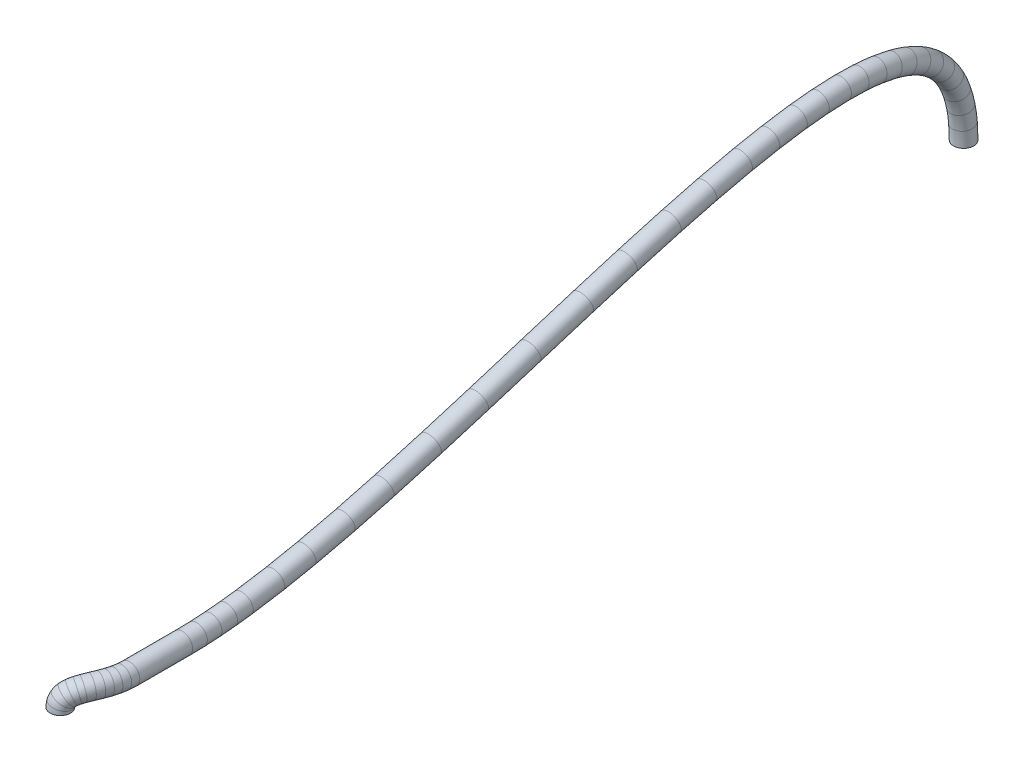
ISO-10303-21;
HEADER;
FILE_DESCRIPTION(('STEP AP214'),'2;1');
FILE_NAME('part.step','',(''),(''),'','','');
FILE_SCHEMA(('AUTOMOTIVE_DESIGN { 1 0 10303 214 1 1 1 1 }'));
ENDSEC;
DATA;
#1=APPLICATION_CONTEXT('core data for automotive mechanical design processes');
#2=APPLICATION_PROTOCOL_DEFINITION('international standard','automotive_design',2000,#1);
#3=PRODUCT_CONTEXT('',#1,'mechanical');
#4=PRODUCT('Part','Part','',(#3));
#5=PRODUCT_RELATED_PRODUCT_CATEGORY('part','',(#4));
#6=PRODUCT_DEFINITION_FORMATION('','',#4);
#7=PRODUCT_DEFINITION_CONTEXT('part definition',#1,'design');
#8=PRODUCT_DEFINITION('design','',#6,#7);
#9=PRODUCT_DEFINITION_SHAPE('','',#8);
#10=(LENGTH_UNIT() NAMED_UNIT(*) SI_UNIT(.MILLI.,.METRE.));
#11=(NAMED_UNIT(*) PLANE_ANGLE_UNIT() SI_UNIT($,.RADIAN.));
#12=(NAMED_UNIT(*) SI_UNIT($,.STERADIAN.) SOLID_ANGLE_UNIT());
#13=UNCERTAINTY_MEASURE_WITH_UNIT(LENGTH_MEASURE(1.E-05),#10,'distance_accuracy_value','');
#14=(GEOMETRIC_REPRESENTATION_CONTEXT(3) GLOBAL_UNCERTAINTY_ASSIGNED_CONTEXT((#13)) GLOBAL_UNIT_ASSIGNED_CONTEXT((#10,
#11,#12)) REPRESENTATION_CONTEXT('',''));
#15=CARTESIAN_POINT('',(0.,0.,0.));
#16=DIRECTION('',(0.,0.,1.));
#17=DIRECTION('',(1.,0.,0.));
#18=AXIS2_PLACEMENT_3D('',#15,#16,#17);
#19=CARTESIAN_POINT('',(-3.74968353162594,128.049999999714,243.374757540876));
#20=DIRECTION('',(0.,1.,0.));
#21=DIRECTION('',(0.,0.,-1.));
#22=AXIS2_PLACEMENT_3D('',#19,#20,#21);
#23=PLANE('',#22);
#24=CARTESIAN_POINT('',(-3.74968353162594,128.049999999714,243.374757540876));
#25=DIRECTION('',(0.,1.,0.));
#26=DIRECTION('',(0.,0.,1.));
#27=AXIS2_PLACEMENT_3D('',#24,#25,#26);
#28=CIRCLE('',#27,0.77);
#29=CARTESIAN_POINT('',(-3.74968353162594,128.049999999714,244.144757540876));
#30=VERTEX_POINT('',#29);
#31=EDGE_CURVE('E11',#30,#30,#28,.T.);
#32=ORIENTED_EDGE('',*,*,#31,.F.);
#33=EDGE_LOOP('',(#32));
#34=FACE_BOUND('',#33,.T.);
#35=ADVANCED_FACE('F42',(#34),#23,.F.);
#36=CARTESIAN_POINT('',(-3.57489488065331,128.049999999715,257.320595256948));
#37=DIRECTION('',(-0.999921466294672,0.,0.0125324077140817));
#38=DIRECTION('',(-0.0125324077140817,0.,-0.999921466294672));
#39=AXIS2_PLACEMENT_3D('',#36,#37,#38);
#40=TOROIDAL_SURFACE('',#39,13.9469330203994,0.77);
#41=ORIENTED_EDGE('',*,*,#31,.T.);
#42=EDGE_LOOP('',(#41));
#43=FACE_BOUND('',#42,.T.);
#44=CARTESIAN_POINT('',(-3.74904137688921,129.244421709112,243.42599305129));
#45=DIRECTION('',(0.00107328111656013,0.996326107369345,0.0856337307484272));
#46=DIRECTION('',(-4.60391044399756E-05,-0.0856337307484272,0.996326684395488));
#47=AXIS2_PLACEMENT_3D('',#44,#45,#46);
#48=CIRCLE('',#47,0.77);
#49=CARTESIAN_POINT('',(-3.74907682699963,129.178483736436,244.193164598274));
#50=VERTEX_POINT('',#49);
#51=EDGE_CURVE('E53',#50,#50,#48,.T.);
#52=ORIENTED_EDGE('',*,*,#51,.F.);
#53=EDGE_LOOP('',(#52));
#54=FACE_BOUND('',#53,.T.);
#55=ADVANCED_FACE('F363',(#43,#54),#40,.T.);
#56=CARTESIAN_POINT('',(-3.62396192345315,128.373826335564,253.5535753326));
#57=DIRECTION('',(0.999923726127993,-1.56135381442176E-05,-0.0123507765961814));
#58=DIRECTION('',(0.0123507765976869,0.,0.999923726249874));
#59=AXIS2_PLACEMENT_3D('',#56,#57,#58);
#60=TOROIDAL_SURFACE('',#59,10.1657023386898,0.77);
#61=CARTESIAN_POINT('',(-3.74689794232879,130.426519028251,243.598031978092));
#62=DIRECTION('',(0.0025092009655732,0.979401327154709,0.201907761807487));
#63=DIRECTION('',(-0.000256872652281758,-0.201907759491489,0.979404508195448));
#64=AXIS2_PLACEMENT_3D('',#61,#62,#63);
#65=CIRCLE('',#64,0.77);
#66=CARTESIAN_POINT('',(-3.74709573427105,130.271050053443,244.352173449402));
#67=VERTEX_POINT('',#66);
#68=EDGE_CURVE('E272',#67,#67,#65,.T.);
#69=ORIENTED_EDGE('',*,*,#68,.F.);
#70=EDGE_LOOP('',(#69));
#71=FACE_BOUND('',#70,.T.);
#72=ORIENTED_EDGE('',*,*,#51,.T.);
#73=EDGE_LOOP('',(#72));
#74=FACE_BOUND('',#73,.T.);
#75=ADVANCED_FACE('F369',(#71,#74),#60,.T.);
#76=CARTESIAN_POINT('',(-3.64297806845377,128.677711002938,252.079747241306));
#77=DIRECTION('',(0.999924861807434,-3.46504543539627E-05,-0.0122584476476254));
#78=DIRECTION('',(0.0122584476549845,0.,0.999924862407716));
#79=AXIS2_PLACEMENT_3D('',#76,#77,#78);
#80=TOROIDAL_SURFACE('',#79,8.66075185280262,0.77);
#81=CARTESIAN_POINT('',(-3.74293003548531,131.574581719271,243.91845002132));
#82=DIRECTION('',(0.00413288953237224,0.942401928786135,0.334457058296406));
#83=DIRECTION('',(-0.000714986324046932,-0.334457044428597,0.942410724804553));
#84=AXIS2_PLACEMENT_3D('',#81,#82,#83);
#85=CIRCLE('',#84,0.77);
#86=CARTESIAN_POINT('',(-3.74348057495483,131.317049795061,244.644106279419));
#87=VERTEX_POINT('',#86);
#88=EDGE_CURVE('E506',#87,#87,#85,.T.);
#89=ORIENTED_EDGE('',*,*,#88,.F.);
#90=EDGE_LOOP('',(#89));
#91=FACE_BOUND('',#90,.T.);
#92=ORIENTED_EDGE('',*,*,#68,.T.);
#93=EDGE_LOOP('',(#92));
#94=FACE_BOUND('',#93,.T.);
#95=ADVANCED_FACE('F515',(#91,#94),#80,.T.);
#96=CARTESIAN_POINT('',(-3.66728173386011,129.341525842741,250.2096119713));
#97=DIRECTION('',(0.999927259751701,-0.000104786281678555,-0.012060855081193));
#98=DIRECTION('',(0.012060855147408,0.,0.999927265241384));
#99=AXIS2_PLACEMENT_3D('',#96,#97,#98);
#100=TOROIDAL_SURFACE('',#99,6.67615008025848,0.77);
#101=CARTESIAN_POINT('',(-3.73682959366278,132.656122237585,244.414821748297));
#102=DIRECTION('',(0.00607896479311895,0.868046320935459,0.496445999981325));
#103=DIRECTION('',(-0.00162868645288827,-0.496445919935974,0.868066124186034));
#104=AXIS2_PLACEMENT_3D('',#101,#102,#103);
#105=CIRCLE('',#104,0.77);
#106=CARTESIAN_POINT('',(-3.7380836822315,132.273858879235,245.083232663921));
#107=VERTEX_POINT('',#106);
#108=EDGE_CURVE('E262',#107,#107,#105,.T.);
#109=ORIENTED_EDGE('',*,*,#108,.F.);
#110=EDGE_LOOP('',(#109));
#111=FACE_BOUND('',#110,.T.);
#112=ORIENTED_EDGE('',*,*,#88,.T.);
#113=EDGE_LOOP('',(#112));
#114=FACE_BOUND('',#113,.T.);
#115=ADVANCED_FACE('F527',(#111,#114),#100,.T.);
#116=CARTESIAN_POINT('',(-3.6737908037922,129.618432694617,249.725514193059));
#117=DIRECTION('',(0.999928443325836,-0.000161505477799532,-0.0119616948611179));
#118=DIRECTION('',(0.0119616950171224,0.,0.999928456366913));
#119=AXIS2_PLACEMENT_3D('',#116,#117,#118);
#120=TOROIDAL_SURFACE('',#119,6.1184136744201,0.77);
#121=CARTESIAN_POINT('',(-3.72911386483873,133.561643425338,245.04758576443));
#122=DIRECTION('',(0.00783258490682145,0.764619016978677,0.644434953651833));
#123=DIRECTION('',(-0.00288966355690719,-0.644434724493458,0.764653866603426));
#124=AXIS2_PLACEMENT_3D('',#121,#122,#123);
#125=CIRCLE('',#124,0.77);
#126=CARTESIAN_POINT('',(-3.73133890577755,133.065428687478,245.636369241715));
#127=VERTEX_POINT('',#126);
#128=EDGE_CURVE('E260',#127,#127,#125,.T.);
#129=ORIENTED_EDGE('',*,*,#128,.F.);
#130=EDGE_LOOP('',(#129));
#131=FACE_BOUND('',#130,.T.);
#132=ORIENTED_EDGE('',*,*,#108,.T.);
#133=EDGE_LOOP('',(#132));
#134=FACE_BOUND('',#133,.T.);
#135=ADVANCED_FACE('F615',(#131,#134),#120,.T.);
#136=CARTESIAN_POINT('',(-3.676303124242,129.698910660878,249.63005800289));
#137=DIRECTION('',(0.999930503616955,-0.000310253225086737,-0.011785231405404));
#138=DIRECTION('',(0.0117852319726099,0.,0.999930551742146));
#139=AXIS2_PLACEMENT_3D('',#136,#137,#138);
#140=TOROIDAL_SURFACE('',#139,5.99354195782575,0.77);
#141=CARTESIAN_POINT('',(-3.71960252022102,134.337006732867,245.834174022903));
#142=DIRECTION('',(0.00931648116066649,0.633370134036581,0.773792915765754));
#143=DIRECTION('',(-0.0044764870964178,-0.773792328230094,0.63342355011124));
#144=AXIS2_PLACEMENT_3D('',#141,#142,#143);
#145=CIRCLE('',#144,0.77);
#146=CARTESIAN_POINT('',(-3.72304941528527,133.74118664013,246.321910156489));
#147=VERTEX_POINT('',#146);
#148=EDGE_CURVE('E258',#147,#147,#145,.T.);
#149=ORIENTED_EDGE('',*,*,#148,.F.);
#150=EDGE_LOOP('',(#149));
#151=FACE_BOUND('',#150,.T.);
#152=ORIENTED_EDGE('',*,*,#128,.T.);
#153=EDGE_LOOP('',(#152));
#154=FACE_BOUND('',#153,.T.);
#155=ADVANCED_FACE('F410',(#151,#154),#140,.T.);
#156=CARTESIAN_POINT('',(-3.67427278205336,129.387492829691,249.88493735603));
#157=DIRECTION('',(0.999931484793308,-0.000416360646926431,-0.0116983914647522));
#158=DIRECTION('',(0.0116983924787466,0.,0.999931571465474));
#159=AXIS2_PLACEMENT_3D('',#156,#157,#158);
#160=TOROIDAL_SURFACE('',#159,6.39596953118865,0.77);
#161=CARTESIAN_POINT('',(-3.7084524315179,134.970619210377,246.764687716538));
#162=DIRECTION('',(0.0104148005759103,0.487875323146402,0.87285119063547));
#163=DIRECTION('',(-0.0062196697506987,-0.872850040660919,0.487948893047647));
#164=AXIS2_PLACEMENT_3D('',#161,#162,#163);
#165=CIRCLE('',#164,0.77);
#166=CARTESIAN_POINT('',(-3.71324157722594,134.298524679068,247.140408364185));
#167=VERTEX_POINT('',#166);
#168=EDGE_CURVE('E255',#167,#167,#165,.T.);
#169=ORIENTED_EDGE('',*,*,#168,.F.);
#170=EDGE_LOOP('',(#169));
#171=FACE_BOUND('',#170,.T.);
#172=ORIENTED_EDGE('',*,*,#148,.T.);
#173=EDGE_LOOP('',(#172));
#174=FACE_BOUND('',#173,.T.);
#175=ADVANCED_FACE('F406',(#171,#174),#160,.T.);
#176=CARTESIAN_POINT('',(-3.66806613831771,127.989365269457,250.666338930104));
#177=DIRECTION('',(0.999933013635121,-0.000673159565455074,-0.0115548733781388));
#178=DIRECTION('',(0.0115548759961493,0.,0.999933240191921));
#179=AXIS2_PLACEMENT_3D('',#176,#177,#178);
#180=TOROIDAL_SURFACE('',#179,7.99765089464495,0.77);
#181=CARTESIAN_POINT('',(-3.69633890299015,135.449911800551,247.785043051377));
#182=DIRECTION('',(0.011021391598779,0.360284488203109,0.932777367053602));
#183=DIRECTION('',(-0.00773420938151877,-0.932775406000503,0.360375115630698));
#184=AXIS2_PLACEMENT_3D('',#181,#182,#183);
#185=CIRCLE('',#184,0.77);
#186=CARTESIAN_POINT('',(-3.70229424421392,134.731674737931,248.062531890413));
#187=VERTEX_POINT('',#186);
#188=EDGE_CURVE('E259',#187,#187,#185,.T.);
#189=ORIENTED_EDGE('',*,*,#188,.F.);
#190=EDGE_LOOP('',(#189));
#191=FACE_BOUND('',#190,.T.);
#192=ORIENTED_EDGE('',*,*,#168,.T.);
#193=EDGE_LOOP('',(#192));
#194=FACE_BOUND('',#193,.T.);
#195=ADVANCED_FACE('F409',(#191,#194),#180,.T.);
#196=CARTESIAN_POINT('',(-3.66499366198673,126.759352754111,251.141393945651));
#197=DIRECTION('',(0.99993360202921,-0.000832261267531237,-0.0114934274292904));
#198=DIRECTION('',(0.0114934314098044,0.,0.999933948335803));
#199=AXIS2_PLACEMENT_3D('',#196,#197,#198);
#200=TOROIDAL_SURFACE('',#199,9.31621652760905,0.77);
#201=CARTESIAN_POINT('',(-3.68322899083849,135.801932792062,248.900121066387));
#202=DIRECTION('',(0.0113560651723383,0.240584108696933,0.970561861205304));
#203=DIRECTION('',(-0.00914133689401931,-0.970558910298777,0.240690335492395));
#204=AXIS2_PLACEMENT_3D('',#201,#202,#203);
#205=CIRCLE('',#204,0.77);
#206=CARTESIAN_POINT('',(-3.69026782024688,135.054602431132,249.085452624716));
#207=VERTEX_POINT('',#206);
#208=EDGE_CURVE('E280',#207,#207,#205,.T.);
#209=ORIENTED_EDGE('',*,*,#208,.F.);
#210=EDGE_LOOP('',(#209));
#211=FACE_BOUND('',#210,.T.);
#212=ORIENTED_EDGE('',*,*,#188,.T.);
#213=EDGE_LOOP('',(#212));
#214=FACE_BOUND('',#213,.T.);
#215=ADVANCED_FACE('F412',(#211,#214),#200,.T.);
#216=CARTESIAN_POINT('',(-3.66317642336996,123.386435817015,251.977455623718));
#217=DIRECTION('',(0.999934288916584,-0.00121053123396785,-0.0113996694257865));
#218=DIRECTION('',(0.0113996777782529,0.,0.999935021562177));
#219=AXIS2_PLACEMENT_3D('',#216,#217,#218);
#220=TOROIDAL_SURFACE('',#219,12.791206167543,0.77);
#221=CARTESIAN_POINT('',(-3.66986690857346,136.031256444592,250.047838626902));
#222=DIRECTION('',(0.0114518236066513,0.150851017771999,0.988490175051444));
#223=DIRECTION('',(-0.0101859073416779,-0.988486109490571,0.150968402772966));
#224=AXIS2_PLACEMENT_3D('',#221,#222,#223);
#225=CIRCLE('',#224,0.77);
#226=CARTESIAN_POINT('',(-3.67771005722656,135.270122140285,250.164084297038));
#227=VERTEX_POINT('',#226);
#228=EDGE_CURVE('E276',#227,#227,#225,.T.);
#229=ORIENTED_EDGE('',*,*,#228,.F.);
#230=EDGE_LOOP('',(#229));
#231=FACE_BOUND('',#230,.T.);
#232=ORIENTED_EDGE('',*,*,#208,.T.);
#233=EDGE_LOOP('',(#232));
#234=FACE_BOUND('',#233,.T.);
#235=ADVANCED_FACE('F415',(#231,#234),#220,.T.);
#236=CARTESIAN_POINT('',(-3.66548148912358,121.04671640111,252.334541067051));
#237=DIRECTION('',(0.99993438386414,-0.00144161136022933,-0.0113644059646101));
#238=DIRECTION('',(0.0113644177736289,0.,0.999935422919233));
#239=AXIS2_PLACEMENT_3D('',#236,#237,#238);
#240=TOROIDAL_SURFACE('',#239,15.1580166115629,0.77);
#241=CARTESIAN_POINT('',(-3.65422136859531,136.176266224485,251.406067616637));
#242=DIRECTION('',(0.0114313665546631,0.0612405030804673,0.998057575814714));
#243=DIRECTION('',(-0.0112180134444045,-0.998052125044579,0.0613686554224686));
#244=AXIS2_PLACEMENT_3D('',#241,#242,#243);
#245=CIRCLE('',#244,0.77);
#246=CARTESIAN_POINT('',(-3.6628592389475,135.4077660882,251.453321481312));
#247=VERTEX_POINT('',#246);
#248=EDGE_CURVE('E281',#247,#247,#245,.T.);
#249=ORIENTED_EDGE('',*,*,#248,.F.);
#250=EDGE_LOOP('',(#249));
#251=FACE_BOUND('',#250,.T.);
#252=ORIENTED_EDGE('',*,*,#228,.T.);
#253=EDGE_LOOP('',(#252));
#254=FACE_BOUND('',#253,.T.);
#255=ADVANCED_FACE('F549',(#251,#254),#240,.T.);
#256=CARTESIAN_POINT('',(-3.68281952873534,114.77656851712,252.719473978342));
#257=DIRECTION('',(0.999933770131024,-0.00203156120989126,-0.0113281997954771));
#258=DIRECTION('',(0.0113282231726545,0.,0.999935833621213));
#259=AXIS2_PLACEMENT_3D('',#256,#257,#258);
#260=TOROIDAL_SURFACE('',#259,21.4399840506549,0.77);
#261=CARTESIAN_POINT('',(-3.63866380234682,136.216442461495,252.772120093432));
#262=DIRECTION('',(0.0113231530981062,-0.0024786787673052,0.999932818921094));
#263=DIRECTION('',(-0.011943611286467,-0.999925926538434,-0.00234341325687878));
#264=AXIS2_PLACEMENT_3D('',#261,#262,#263);
#265=CIRCLE('',#264,0.77);
#266=CARTESIAN_POINT('',(-3.6478603830374,135.446499498061,252.770315665224));
#267=VERTEX_POINT('',#266);
#268=EDGE_CURVE('E282',#267,#267,#265,.T.);
#269=ORIENTED_EDGE('',*,*,#268,.F.);
#270=EDGE_LOOP('',(#269));
#271=FACE_BOUND('',#270,.T.);
#272=ORIENTED_EDGE('',*,*,#248,.T.);
#273=EDGE_LOOP('',(#272));
#274=FACE_BOUND('',#273,.T.);
#275=ADVANCED_FACE('F551',(#271,#274),#260,.T.);
#276=CARTESIAN_POINT('',(-3.70077807656531,110.657380501893,252.70946650955));
#277=DIRECTION('',(0.999932937891432,-0.00240229079995971,-0.0113291093525691));
#278=DIRECTION('',(0.0113291420428618,0.,0.999935823210956));
#279=AXIS2_PLACEMENT_3D('',#276,#277,#278);
#280=TOROIDAL_SURFACE('',#279,25.5592142271515,0.77);
#281=CARTESIAN_POINT('',(-3.61965239461575,136.156251354112,254.462873420404));
#282=DIRECTION('',(0.0111375608198057,-0.0686331117157715,0.997579796665508));
#283=DIRECTION('',(-0.0126873957821717,-0.997571066073339,-0.0684908615916703));
#284=AXIS2_PLACEMENT_3D('',#281,#282,#283);
#285=CIRCLE('',#284,0.77);
#286=CARTESIAN_POINT('',(-3.62942168936802,135.388121633235,254.410135456978));
#287=VERTEX_POINT('',#286);
#288=EDGE_CURVE('E286',#287,#287,#285,.T.);
#289=ORIENTED_EDGE('',*,*,#288,.F.);
#290=EDGE_LOOP('',(#289));
#291=FACE_BOUND('',#290,.T.);
#292=ORIENTED_EDGE('',*,*,#268,.T.);
#293=EDGE_LOOP('',(#292));
#294=FACE_BOUND('',#293,.T.);
#295=ADVANCED_FACE('F610',(#291,#294),#280,.T.);
#296=CARTESIAN_POINT('',(-3.77324801372848,99.4965880502139,251.942417317701));
#297=DIRECTION('',(0.999929239218928,-0.00340582268664042,-0.0113981106716906));
#298=DIRECTION('',(0.0113981767791885,0.,0.999935038673068));
#299=AXIS2_PLACEMENT_3D('',#296,#297,#298);
#300=TOROIDAL_SURFACE('',#299,36.7465264227112,0.77);
#301=CARTESIAN_POINT('',(-3.60097097834687,136.001245847421,256.148066359987));
#302=DIRECTION('',(0.0109332901309618,-0.114495586102539,0.993363591002785));
#303=DIRECTION('',(-0.0131957632904346,-0.993352983136303,-0.1143491264741));
#304=AXIS2_PLACEMENT_3D('',#301,#302,#303);
#305=CIRCLE('',#304,0.77);
#306=CARTESIAN_POINT('',(-3.61113171608051,135.236364050406,256.060017532601));
#307=VERTEX_POINT('',#306);
#308=EDGE_CURVE('E313',#307,#307,#305,.T.);
#309=ORIENTED_EDGE('',*,*,#308,.F.);
#310=EDGE_LOOP('',(#309));
#311=FACE_BOUND('',#310,.T.);
#312=ORIENTED_EDGE('',*,*,#288,.T.);
#313=EDGE_LOOP('',(#312));
#314=FACE_BOUND('',#313,.T.);
#315=ADVANCED_FACE('F372',(#311,#314),#300,.T.);
#316=CARTESIAN_POINT('',(-3.83695933223886,92.2051185638422,251.102700112807));
#317=DIRECTION('',(0.999925902291017,-0.00406610011188762,-0.0114741778518016));
#318=DIRECTION('',(0.011474272705245,0.,0.999934168366041));
#319=AXIS2_PLACEMENT_3D('',#316,#317,#318);
#320=TOROIDAL_SURFACE('',#319,44.0864171385112,0.77);
#321=CARTESIAN_POINT('',(-3.5779174970338,135.705597552396,258.261848190952));
#322=DIRECTION('',(0.0106613884787951,-0.162444361746452,0.986660105675958));
#323=DIRECTION('',(-0.0137186629416297,-0.986647080967109,-0.162293979882735));
#324=AXIS2_PLACEMENT_3D('',#321,#322,#323);
#325=CIRCLE('',#324,0.77);
#326=CARTESIAN_POINT('',(-3.58848086749885,134.945879300052,258.136881826443));
#327=VERTEX_POINT('',#326);
#328=EDGE_CURVE('E305',#327,#327,#325,.T.);
#329=ORIENTED_EDGE('',*,*,#328,.F.);
#330=EDGE_LOOP('',(#329));
#331=FACE_BOUND('',#330,.T.);
#332=ORIENTED_EDGE('',*,*,#308,.T.);
#333=EDGE_LOOP('',(#332));
#334=FACE_BOUND('',#333,.T.);
#335=ADVANCED_FACE('F417',(#331,#334),#320,.T.);
#336=CARTESIAN_POINT('',(-4.08426599900101,71.8011531395204,247.746050250386));
#337=DIRECTION('',(0.999912601927666,-0.00598279508960853,-0.0117896000424699));
#338=DIRECTION('',(0.011789811045646,0.,0.999930497762474));
#339=AXIS2_PLACEMENT_3D('',#336,#337,#338);
#340=TOROIDAL_SURFACE('',#339,64.7658583734563,0.77);
#341=CARTESIAN_POINT('',(-3.55543554196876,135.324139513465,260.362188777444));
#342=DIRECTION('',(0.0103979295285411,-0.194875369792719,0.980772895888579));
#343=DIRECTION('',(-0.0140657835414622,-0.980757382188605,-0.194723165072674));
#344=AXIS2_PLACEMENT_3D('',#341,#342,#343);
#345=CIRCLE('',#344,0.77);
#346=CARTESIAN_POINT('',(-3.56626619529569,134.56895632918,260.212251940339));
#347=VERTEX_POINT('',#346);
#348=EDGE_CURVE('E253',#347,#347,#345,.T.);
#349=ORIENTED_EDGE('',*,*,#348,.F.);
#350=EDGE_LOOP('',(#349));
#351=FACE_BOUND('',#350,.T.);
#352=ORIENTED_EDGE('',*,*,#328,.T.);
#353=EDGE_LOOP('',(#352));
#354=FACE_BOUND('',#353,.T.);
#355=ADVANCED_FACE('F404',(#351,#354),#340,.T.);
#356=CARTESIAN_POINT('',(-4.31591775887795,57.5750148695578,244.921833483145));
#357=DIRECTION('',(0.999899919531076,-0.00738368115377129,-0.0120678156418905));
#358=DIRECTION('',(0.0120681446164382,0.,0.999927177291185));
#359=AXIS2_PLACEMENT_3D('',#356,#357,#358);
#360=TOROIDAL_SURFACE('',#359,79.2711125676326,0.77);
#361=CARTESIAN_POINT('',(-3.52680457670898,134.730170501625,263.097876712832));
#362=DIRECTION('',(0.0100526920883623,-0.229386802407344,0.973283431618514));
#363=DIRECTION('',(-0.0144269577185918,-0.973264576160402,-0.229233347666301));
#364=AXIS2_PLACEMENT_3D('',#361,#362,#363);
#365=CIRCLE('',#364,0.77);
#366=CARTESIAN_POINT('',(-3.5379133341523,133.980756777982,262.921367035129));
#367=VERTEX_POINT('',#366);
#368=EDGE_CURVE('E249',#367,#367,#365,.T.);
#369=ORIENTED_EDGE('',*,*,#368,.F.);
#370=EDGE_LOOP('',(#369));
#371=FACE_BOUND('',#370,.T.);
#372=ORIENTED_EDGE('',*,*,#348,.T.);
#373=EDGE_LOOP('',(#372));
#374=FACE_BOUND('',#373,.T.);
#375=ADVANCED_FACE('F401',(#371,#374),#360,.T.);
#376=CARTESIAN_POINT('',(-5.3916457097763,12.5276460749525,234.316024745884));
#377=DIRECTION('',(0.999839165076537,-0.0121510282503366,-0.0131907729687246));
#378=DIRECTION('',(0.0131917468688151,0.,0.99991298512148));
#379=AXIS2_PLACEMENT_3D('',#376,#377,#378);
#380=TOROIDAL_SURFACE('',#379,125.560063759742,0.77);
#381=CARTESIAN_POINT('',(-3.499124076831,134.057583464795,265.815584921231));
#382=DIRECTION('',(0.00971902793698738,-0.251030915605625,0.967930276366104));
#383=DIRECTION('',(-0.0146474139412622,-0.967907881078682,-0.250878032140339));
#384=AXIS2_PLACEMENT_3D('',#381,#382,#383);
#385=CIRCLE('',#384,0.77);
#386=CARTESIAN_POINT('',(-3.51040258556577,133.312294396364,265.622408836483));
#387=VERTEX_POINT('',#386);
#388=EDGE_CURVE('E254',#387,#387,#385,.T.);
#389=ORIENTED_EDGE('',*,*,#388,.F.);
#390=EDGE_LOOP('',(#389));
#391=FACE_BOUND('',#390,.T.);
#392=ORIENTED_EDGE('',*,*,#368,.T.);
#393=EDGE_LOOP('',(#392));
#394=FACE_BOUND('',#393,.T.);
#395=ADVANCED_FACE('F376',(#391,#394),#380,.T.);
#396=CARTESIAN_POINT('',(-6.63767229498544,-23.3288101017454,225.029230979255));
#397=DIRECTION('',(0.999766490161775,-0.0162437742654542,-0.0142514892982556));
#398=DIRECTION('',(-0.0162454241122349,-0.999868034390246,0.));
#399=AXIS2_PLACEMENT_3D('',#396,#397,#398);
#400=TOROIDAL_SURFACE('',#399,162.615663552684,0.77);
#401=CARTESIAN_POINT('',(-3.46593820794016,133.145546053802,269.183166265566));
#402=DIRECTION('',(0.00930270812436092,-0.271737825723965,0.962326355085615));
#403=DIRECTION('',(-0.0148514872069348,-0.962299395928259,-0.271586645334139));
#404=AXIS2_PLACEMENT_3D('',#401,#402,#403);
#405=CIRCLE('',#404,0.77);
#406=CARTESIAN_POINT('',(-3.4773738530895,132.404575518937,268.974044548659));
#407=VERTEX_POINT('',#406);
#408=EDGE_CURVE('E219',#407,#407,#405,.T.);
#409=ORIENTED_EDGE('',*,*,#408,.F.);
#410=EDGE_LOOP('',(#409));
#411=FACE_BOUND('',#410,.T.);
#412=ORIENTED_EDGE('',*,*,#388,.T.);
#413=EDGE_LOOP('',(#412));
#414=FACE_BOUND('',#413,.T.);
#415=ADVANCED_FACE('F373',(#411,#414),#400,.T.);
#416=CARTESIAN_POINT('',(-16.9990722425859,-186.818386888551,178.963867798838));
#417=DIRECTION('',(0.999129131083776,-0.0366199012053915,-0.0199990563649066));
#418=DIRECTION('',(-0.0366272266920443,-0.99932899801059,0.));
#419=AXIS2_PLACEMENT_3D('',#416,#417,#418);
#420=TOROIDAL_SURFACE('',#419,332.71547291427,0.77);
#421=CARTESIAN_POINT('',(-3.43422373253834,132.179814249409,272.535917430186));
#422=DIRECTION('',(0.00887564310102645,-0.281807888255375,0.959429797888616));
#423=DIRECTION('',(-0.0149467755076472,-0.959397788967474,-0.281660214489455));
#424=AXIS2_PLACEMENT_3D('',#421,#422,#423);
#425=CIRCLE('',#424,0.77);
#426=CARTESIAN_POINT('',(-3.44573274967923,131.441077951904,272.31903906503));
#427=VERTEX_POINT('',#426);
#428=EDGE_CURVE('E213',#427,#427,#425,.T.);
#429=ORIENTED_EDGE('',*,*,#428,.F.);
#430=EDGE_LOOP('',(#429));
#431=FACE_BOUND('',#430,.T.);
#432=ORIENTED_EDGE('',*,*,#408,.T.);
#433=EDGE_LOOP('',(#432));
#434=FACE_BOUND('',#433,.T.);
#435=ADVANCED_FACE('F375',(#431,#434),#420,.T.);
#436=CARTESIAN_POINT('',(-49.3662060078035,-443.679255745309,103.817004464301));
#437=DIRECTION('',(0.997043751117183,-0.0707369243477478,-0.0300007648568781));
#438=DIRECTION('',(-0.0707687790914956,-0.997492746793629,0.));
#439=AXIS2_PLACEMENT_3D('',#436,#437,#438);
#440=TOROIDAL_SURFACE('',#439,601.821806752885,0.77);
#441=CARTESIAN_POINT('',(-3.39817440198848,130.985994759763,276.548811076564));
#442=DIRECTION('',(0.00834446385746464,-0.288457883314737,0.957456223268987));
#443=DIRECTION('',(-0.0150065627843381,-0.957417857161314,-0.288315538710694));
#444=AXIS2_PLACEMENT_3D('',#441,#442,#443);
#445=CIRCLE('',#444,0.77);
#446=CARTESIAN_POINT('',(-3.40972945533242,130.248783009749,276.326808111757));
#447=VERTEX_POINT('',#446);
#448=EDGE_CURVE('E209',#447,#447,#445,.T.);
#449=ORIENTED_EDGE('',*,*,#448,.F.);
#450=EDGE_LOOP('',(#449));
#451=FACE_BOUND('',#450,.T.);
#452=ORIENTED_EDGE('',*,*,#428,.T.);
#453=EDGE_LOOP('',(#452));
#454=FACE_BOUND('',#453,.T.);
#455=ADVANCED_FACE('F389',(#451,#454),#440,.T.);
#456=CARTESIAN_POINT('',(-126.82287610893,1006.20272826002,541.305646105521));
#457=DIRECTION('',(-0.990977551170584,-0.130471344857354,-0.0306711794208363));
#458=DIRECTION('',(-0.130532756772493,0.991443997111977,0.));
#459=AXIS2_PLACEMENT_3D('',#456,#457,#458);
#460=TOROIDAL_SURFACE('',#459,922.67771691141,0.77);
#461=CARTESIAN_POINT('',(-3.36450797302752,129.787270950207,280.560278341283));
#462=DIRECTION('',(0.00773737452209681,-0.28415059232391,0.95874844141593));
#463=DIRECTION('',(-0.014970480312079,-0.958702606388962,-0.284016191831094));
#464=AXIS2_PLACEMENT_3D('',#461,#462,#463);
#465=CIRCLE('',#464,0.77);
#466=CARTESIAN_POINT('',(-3.37603524286782,129.049069943287,280.341585873573));
#467=VERTEX_POINT('',#466);
#468=EDGE_CURVE('E46',#467,#467,#465,.T.);
#469=ORIENTED_EDGE('',*,*,#468,.F.);
#470=EDGE_LOOP('',(#469));
#471=FACE_BOUND('',#470,.T.);
#472=ORIENTED_EDGE('',*,*,#448,.T.);
#473=EDGE_LOOP('',(#472));
#474=FACE_BOUND('',#473,.T.);
#475=ADVANCED_FACE('F210',(#471,#474),#460,.T.);
#476=CARTESIAN_POINT('',(-32.1032976753224,537.44212333654,401.611563052911));
#477=DIRECTION('',(-0.997694178442119,-0.0668434624222363,-0.0117591595835997));
#478=DIRECTION('',(-0.0668480843861824,0.997763165091746,0.));
#479=AXIS2_PLACEMENT_3D('',#476,#477,#478);
#480=TOROIDAL_SURFACE('',#479,426.218031338435,0.77);
#481=CARTESIAN_POINT('',(-3.33661388280709,128.737820788068,284.159099392247));
#482=DIRECTION('',(0.00714402019867262,-0.275727216171857,0.961209376378278));
#483=DIRECTION('',(-0.014905257058022,-0.961156479378031,-0.275601261720011));
#484=AXIS2_PLACEMENT_3D('',#481,#482,#483);
#485=CIRCLE('',#484,0.77);
#486=CARTESIAN_POINT('',(-3.34809093074177,127.997730298947,283.946886420723));
#487=VERTEX_POINT('',#486);
#488=EDGE_CURVE('E222',#487,#487,#485,.T.);
#489=ORIENTED_EDGE('',*,*,#488,.F.);
#490=EDGE_LOOP('',(#489));
#491=FACE_BOUND('',#490,.T.);
#492=ORIENTED_EDGE('',*,*,#468,.T.);
#493=EDGE_LOOP('',(#492));
#494=FACE_BOUND('',#493,.T.);
#495=ADVANCED_FACE('F429',(#491,#494),#480,.T.);
#496=CARTESIAN_POINT('',(-10.6184575935603,313.474990909698,337.205905356286));
#497=DIRECTION('',(-0.999257547958648,-0.0383608735236172,-0.00357718187607984));
#498=DIRECTION('',(-0.0383611189632563,0.999263941384801,0.));
#499=AXIS2_PLACEMENT_3D('',#496,#497,#498);
#500=TOROIDAL_SURFACE('',#499,192.340351708534,0.77);
#501=CARTESIAN_POINT('',(-3.31121754884281,127.739344234701,287.772266075813));
#502=DIRECTION('',(0.00640483072992393,-0.256956359192495,0.966401783738968));
#503=DIRECTION('',(-0.0147734023820943,-0.96634044815675,-0.256842139919191));
#504=AXIS2_PLACEMENT_3D('',#501,#502,#503);
#505=CIRCLE('',#504,0.77);
#506=CARTESIAN_POINT('',(-3.32259306867702,126.99526208962,287.574497628075));
#507=VERTEX_POINT('',#506);
#508=EDGE_CURVE('E295',#507,#507,#505,.T.);
#509=ORIENTED_EDGE('',*,*,#508,.F.);
#510=EDGE_LOOP('',(#509));
#511=FACE_BOUND('',#510,.T.);
#512=ORIENTED_EDGE('',*,*,#488,.T.);
#513=EDGE_LOOP('',(#512));
#514=FACE_BOUND('',#513,.T.);
#515=ADVANCED_FACE('F44',(#511,#514),#500,.T.);
#516=CARTESIAN_POINT('',(-8.16448189777563,270.427390931367,325.74372466948));
#517=DIRECTION('',(-0.999439724113133,-0.0333938837881178,-0.00225530268720799));
#518=DIRECTION('',(-0.0333939687156036,0.999442265893044,0.));
#519=AXIS2_PLACEMENT_3D('',#516,#517,#518);
#520=TOROIDAL_SURFACE('',#519,147.733762264017,0.77);
#521=CARTESIAN_POINT('',(-3.29270313539486,126.985456335037,290.730274630478));
#522=DIRECTION('',(0.00572469074171247,-0.236945297043338,0.97150612665333));
#523=DIRECTION('',(-0.01464822169155,-0.97143767730412,-0.236842286585931));
#524=AXIS2_PLACEMENT_3D('',#521,#522,#523);
#525=CIRCLE('',#524,0.77);
#526=CARTESIAN_POINT('',(-3.30398226609735,126.237449323512,290.547906069807));
#527=VERTEX_POINT('',#526);
#528=EDGE_CURVE('E301',#527,#527,#525,.T.);
#529=ORIENTED_EDGE('',*,*,#528,.F.);
#530=EDGE_LOOP('',(#529));
#531=FACE_BOUND('',#530,.T.);
#532=ORIENTED_EDGE('',*,*,#508,.T.);
#533=EDGE_LOOP('',(#532));
#534=FACE_BOUND('',#533,.T.);
#535=ADVANCED_FACE('F532',(#531,#534),#520,.T.);
#536=CARTESIAN_POINT('',(-5.8668113595481,218.496017738125,313.064393307166));
#537=DIRECTION('',(-0.999610434732199,-0.0278952473699344,-0.000913207903480736));
#538=DIRECTION('',(-0.027895259001544,0.999610851544358,0.));
#539=AXIS2_PLACEMENT_3D('',#536,#537,#538);
#540=TOROIDAL_SURFACE('',#539,94.2317448555552,0.77);
#541=CARTESIAN_POINT('',(-3.27658192464598,126.310312221568,293.707013618486));
#542=DIRECTION('',(0.00483694938135772,-0.205368203395891,0.978672828352063));
#543=DIRECTION('',(-0.0144772918789369,-0.978596088579741,-0.205280548119599));
#544=AXIS2_PLACEMENT_3D('',#541,#542,#543);
#545=CIRCLE('',#544,0.77);
#546=CARTESIAN_POINT('',(-3.28772943939276,125.556793233362,293.548947596433));
#547=VERTEX_POINT('',#546);
#548=EDGE_CURVE('E298',#547,#547,#545,.T.);
#549=ORIENTED_EDGE('',*,*,#548,.F.);
#550=EDGE_LOOP('',(#549));
#551=FACE_BOUND('',#550,.T.);
#552=ORIENTED_EDGE('',*,*,#528,.T.);
#553=EDGE_LOOP('',(#552));
#554=FACE_BOUND('',#553,.T.);
#555=ADVANCED_FACE('F535',(#551,#554),#540,.T.);
#556=CARTESIAN_POINT('',(-5.28251166603379,202.16646082596,309.634852917212));
#557=DIRECTION('',(-0.999653591451659,-0.02631272767812,-0.000580913020663511));
#558=DIRECTION('',(-0.0263127321178668,0.99965376012322,0.));
#559=AXIS2_PLACEMENT_3D('',#556,#557,#558);
#560=TOROIDAL_SURFACE('',#559,77.5362824743679,0.77);
#561=CARTESIAN_POINT('',(-3.2658574324187,125.850436193895,296.082266816946));
#562=DIRECTION('',(0.00402743754319642,-0.174744808971003,0.984605520746519));
#563=DIRECTION('',(-0.0143390886815822,-0.98452236798433,-0.174671398558292));
#564=AXIS2_PLACEMENT_3D('',#561,#562,#563);
#565=CIRCLE('',#564,0.77);
#566=CARTESIAN_POINT('',(-3.27689853070351,125.092353970547,295.947769840056));
#567=VERTEX_POINT('',#566);
#568=EDGE_CURVE('E302',#567,#567,#565,.T.);
#569=ORIENTED_EDGE('',*,*,#568,.F.);
#570=EDGE_LOOP('',(#569));
#571=FACE_BOUND('',#570,.T.);
#572=ORIENTED_EDGE('',*,*,#548,.T.);
#573=EDGE_LOOP('',(#572));
#574=FACE_BOUND('',#573,.T.);
#575=ADVANCED_FACE('F442',(#571,#574),#560,.T.);
#576=CARTESIAN_POINT('',(-4.54238851103837,178.571198402121,305.444209722842));
#577=DIRECTION('',(-0.999707833394635,-0.0241703880626751,-0.000200475195568411));
#578=DIRECTION('',(-0.0241703885483827,0.999707853483917,0.));
#579=AXIS2_PLACEMENT_3D('',#576,#577,#578);
#580=TOROIDAL_SURFACE('',#579,53.5607531162907,0.77);
#581=CARTESIAN_POINT('',(-3.2574192646739,125.481596797094,298.47303121131));
#582=DIRECTION('',(0.00294717554234695,-0.130121384875124,0.991493691031114));
#583=DIRECTION('',(-0.0141816596081028,-0.991403724963415,-0.130067423513442));
#584=AXIS2_PLACEMENT_3D('',#581,#582,#583);
#585=CIRCLE('',#584,0.77);
#586=CARTESIAN_POINT('',(-3.26833914257214,124.718215928872,298.372879295205));
#587=VERTEX_POINT('',#586);
#588=EDGE_CURVE('E244',#587,#587,#585,.T.);
#589=ORIENTED_EDGE('',*,*,#588,.F.);
#590=EDGE_LOOP('',(#589));
#591=FACE_BOUND('',#590,.T.);
#592=ORIENTED_EDGE('',*,*,#568,.T.);
#593=EDGE_LOOP('',(#592));
#594=FACE_BOUND('',#593,.T.);
#595=ADVANCED_FACE('F434',(#591,#594),#580,.T.);
#596=CARTESIAN_POINT('',(-4.33750360965809,171.309178611696,304.490549692092));
#597=DIRECTION('',(-0.999722739582014,-0.0235463354448975,-0.000118531636324287));
#598=DIRECTION('',(-0.0235463356103075,0.999722746604941,0.));
#599=AXIS2_PLACEMENT_3D('',#596,#597,#598);
#600=TOROIDAL_SURFACE('',#599,46.2335848256747,0.77);
#601=CARTESIAN_POINT('',(-3.25426701286499,125.341803708272,299.65615119835));
#602=DIRECTION('',(0.00234426512354566,-0.104538432882173,0.994518084537214));
#603=DIRECTION('',(-0.0141135266647719,-0.994425220445405,-0.104495403282586));
#604=AXIS2_PLACEMENT_3D('',#601,#602,#603);
#605=CIRCLE('',#604,0.77);
#606=CARTESIAN_POINT('',(-3.26513442839687,124.576096288529,299.575689737822));
#607=VERTEX_POINT('',#606);
#608=EDGE_CURVE('E241',#607,#607,#605,.T.);
#609=ORIENTED_EDGE('',*,*,#608,.F.);
#610=EDGE_LOOP('',(#609));
#611=FACE_BOUND('',#610,.T.);
#612=ORIENTED_EDGE('',*,*,#588,.T.);
#613=EDGE_LOOP('',(#612));
#614=FACE_BOUND('',#613,.T.);
#615=ADVANCED_FACE('F431',(#611,#614),#600,.T.);
#616=CARTESIAN_POINT('',(-4.11164894133032,162.871002682256,303.603041294846));
#617=DIRECTION('',(-0.999739242498277,-0.0228351723414741,-4.37390662103866E-05));
#618=DIRECTION('',(-0.0228351723633171,0.999739243454581,0.));
#619=AXIS2_PLACEMENT_3D('',#616,#617,#618);
#620=TOROIDAL_SURFACE('',#619,37.7459113128018,0.77);
#621=CARTESIAN_POINT('',(-3.25190164838482,125.235973627363,300.842743581994));
#622=DIRECTION('',(0.00162628880383391,-0.0731103171986618,0.997322533939667));
#623=DIRECTION('',(-0.0140509037136303,-0.997227068550274,-0.0730804067822438));
#624=AXIS2_PLACEMENT_3D('',#621,#622,#623);
#625=CIRCLE('',#624,0.77);
#626=CARTESIAN_POINT('',(-3.26272084424432,124.468108784579,300.786471668771));
#627=VERTEX_POINT('',#626);
#628=EDGE_CURVE('E245',#627,#627,#625,.T.);
#629=ORIENTED_EDGE('',*,*,#628,.F.);
#630=EDGE_LOOP('',(#629));
#631=FACE_BOUND('',#630,.T.);
#632=ORIENTED_EDGE('',*,*,#608,.T.);
#633=EDGE_LOOP('',(#632));
#634=FACE_BOUND('',#633,.T.);
#635=ADVANCED_FACE('F433',(#631,#634),#620,.T.);
#636=CARTESIAN_POINT('',(-4.01791548166478,159.221177354019,303.3353321876));
#637=DIRECTION('',(-0.999746114678268,-0.0225323261623295,-2.15272384254499E-05));
#638=DIRECTION('',(-0.0225323261675505,0.99974611490992,0.));
#639=AXIS2_PLACEMENT_3D('',#636,#637,#638);
#640=TOROIDAL_SURFACE('',#639,34.0850971465815,0.77);
#641=CARTESIAN_POINT('',(-3.25049659723611,125.172566819459,301.958002737697));
#642=DIRECTION('',(0.00088899449843079,-0.0403987784070292,0.999183240648081));
#643=DIRECTION('',(-0.0140097093485879,-0.9990860778777,-0.0403823852059634));
#644=AXIS2_PLACEMENT_3D('',#641,#642,#643);
#645=CIRCLE('',#644,0.77);
#646=CARTESIAN_POINT('',(-3.26128407343452,124.403270539493,301.926908301088));
#647=VERTEX_POINT('',#646);
#648=EDGE_CURVE('E292',#647,#647,#645,.T.);
#649=ORIENTED_EDGE('',*,*,#648,.F.);
#650=EDGE_LOOP('',(#649));
#651=FACE_BOUND('',#650,.T.);
#652=ORIENTED_EDGE('',*,*,#628,.T.);
#653=EDGE_LOOP('',(#652));
#654=FACE_BOUND('',#653,.T.);
#655=ADVANCED_FACE('F381',(#651,#654),#640,.T.);
#656=CARTESIAN_POINT('',(-3.85800924660168,152.779901785578,303.074757540757));
#657=DIRECTION('',(-0.999757967329514,-0.0220001536621363,0.));
#658=DIRECTION('',(-0.0220001536621363,0.999757967329514,0.));
#659=AXIS2_PLACEMENT_3D('',#656,#657,#658);
#660=TOROIDAL_SURFACE('',#659,27.6365909048278,0.77);
#661=CARTESIAN_POINT('',(-3.24999999999787,125.14999983865,303.074757540732));
#662=DIRECTION('',(0.,0.,1.));
#663=DIRECTION('',(-0.0139917521560948,-0.999902110644638,0.));
#664=AXIS2_PLACEMENT_3D('',#661,#662,#663);
#665=CIRCLE('',#664,0.77);
#666=CARTESIAN_POINT('',(-3.26077364915806,124.380075213454,303.074757540732));
#667=VERTEX_POINT('',#666);
#668=EDGE_CURVE('E235',#667,#667,#665,.T.);
#669=ORIENTED_EDGE('',*,*,#668,.F.);
#670=EDGE_LOOP('',(#669));
#671=FACE_BOUND('',#670,.T.);
#672=ORIENTED_EDGE('',*,*,#648,.T.);
#673=EDGE_LOOP('',(#672));
#674=FACE_BOUND('',#673,.T.);
#675=ADVANCED_FACE('F356',(#671,#674),#660,.T.);
#676=CARTESIAN_POINT('',(-4.74999999999876,124.049999838662,310.824757540733));
#677=DIRECTION('',(0.,1.,0.));
#678=DIRECTION('',(1.,0.,0.));
#679=AXIS2_PLACEMENT_3D('',#676,#677,#678);
#680=PLANE('',#679);
#681=CARTESIAN_POINT('',(-4.74999999999876,124.049999838662,310.824757540733));
#682=DIRECTION('',(0.,1.,0.));
#683=DIRECTION('',(0.,0.,1.));
#684=AXIS2_PLACEMENT_3D('',#681,#682,#683);
#685=CIRCLE('',#684,0.77);
#686=CARTESIAN_POINT('',(-4.74999999999876,124.049999838662,311.594757540733));
#687=VERTEX_POINT('',#686);
#688=EDGE_CURVE('E225',#687,#687,#685,.T.);
#689=ORIENTED_EDGE('',*,*,#688,.F.);
#690=EDGE_LOOP('',(#689));
#691=FACE_BOUND('',#690,.T.);
#692=ADVANCED_FACE('F350',(#691),#680,.F.);
#693=CARTESIAN_POINT('',(-3.86175228391471,124.049999838662,309.886989729328));
#694=DIRECTION('',(0.726016031521425,0.,0.687677774814543));
#695=DIRECTION('',(-0.687677774814543,0.,0.726016031521425));
#696=AXIS2_PLACEMENT_3D('',#693,#694,#695);
#697=TOROIDAL_SURFACE('',#696,1.29166267780515,0.77);
#698=ORIENTED_EDGE('',*,*,#688,.T.);
#699=EDGE_LOOP('',(#698));
#700=FACE_BOUND('',#699,.T.);
#701=CARTESIAN_POINT('',(-4.72594926344536,124.348539037265,310.799365967896));
#702=DIRECTION('',(0.158941475446666,0.97292339049372,-0.167802513726828));
#703=DIRECTION('',(0.0135184058559552,0.167802513726828,0.985727938677844));
#704=AXIS2_PLACEMENT_3D('',#701,#702,#703);
#705=CIRCLE('',#704,0.77);
#706=CARTESIAN_POINT('',(-4.71554009093628,124.477746972834,311.558376480678));
#707=VERTEX_POINT('',#706);
#708=EDGE_CURVE('E267',#707,#707,#705,.T.);
#709=ORIENTED_EDGE('',*,*,#708,.F.);
#710=EDGE_LOOP('',(#709));
#711=FACE_BOUND('',#710,.T.);
#712=ADVANCED_FACE('F345',(#700,#711),#697,.T.);
#713=CARTESIAN_POINT('',(-4.201900151941,124.150318435409,310.146453692624));
#714=DIRECTION('',(-0.776998296788141,0.0184087433886088,-0.629233474121634));
#715=DIRECTION('',(0.629340119124034,0.,-0.77712998556287));
#716=AXIS2_PLACEMENT_3D('',#713,#714,#715);
#717=TOROIDAL_SURFACE('',#716,0.860356506030778,0.77);
#718=CARTESIAN_POINT('',(-4.64784280395366,124.622251043349,310.710925199565));
#719=DIRECTION('',(0.357232151337543,0.835927244836917,-0.416666331001332));
#720=DIRECTION('',(0.0841919233066507,0.415466924127226,0.905703569058988));
#721=AXIS2_PLACEMENT_3D('',#718,#719,#720);
#722=CIRCLE('',#721,0.77);
#723=CARTESIAN_POINT('',(-4.58301502300754,124.942160574927,311.40831694774));
#724=VERTEX_POINT('',#723);
#725=EDGE_CURVE('E266',#724,#724,#722,.T.);
#726=ORIENTED_EDGE('',*,*,#725,.F.);
#727=EDGE_LOOP('',(#726));
#728=FACE_BOUND('',#727,.T.);
#729=ORIENTED_EDGE('',*,*,#708,.T.);
#730=EDGE_LOOP('',(#729));
#731=FACE_BOUND('',#730,.T.);
#732=ADVANCED_FACE('F339',(#728,#731),#717,.T.);
#733=CARTESIAN_POINT('',(-4.24336841160888,124.156927523669,310.124159885846));
#734=DIRECTION('',(-0.804083139085628,0.0482660297882527,-0.592554382151278));
#735=DIRECTION('',(0.593245800635375,0.,-0.805021378615806));
#736=AXIS2_PLACEMENT_3D('',#733,#734,#735);
#737=TOROIDAL_SURFACE('',#736,0.851128101647424,0.77);
#738=CARTESIAN_POINT('',(-4.52217383450134,124.834246876814,310.557663144696));
#739=DIRECTION('',(0.496132170010669,0.603645955630134,-0.624070853454868));
#740=DIRECTION('',(0.204012937248203,0.61759761580004,0.759573502956408));
#741=AXIS2_PLACEMENT_3D('',#738,#739,#740);
#742=CIRCLE('',#741,0.77);
#743=CARTESIAN_POINT('',(-4.36508387282022,125.30979704098,311.142534741973));
#744=VERTEX_POINT('',#743);
#745=EDGE_CURVE('E239',#744,#744,#742,.T.);
#746=ORIENTED_EDGE('',*,*,#745,.F.);
#747=EDGE_LOOP('',(#746));
#748=FACE_BOUND('',#747,.T.);
#749=ORIENTED_EDGE('',*,*,#725,.T.);
#750=EDGE_LOOP('',(#749));
#751=FACE_BOUND('',#750,.T.);
#752=ADVANCED_FACE('F333',(#748,#751),#737,.T.);
#753=CARTESIAN_POINT('',(-4.24304862619485,123.862119773045,309.839254975553));
#754=DIRECTION('',(-0.838588239240287,0.146891530422881,-0.524588070106345));
#755=DIRECTION('',(0.53034088656787,0.,-0.847784491503829));
#756=AXIS2_PLACEMENT_3D('',#753,#754,#755);
#757=TOROIDAL_SURFACE('',#756,1.24058546069468,0.77);
#758=CARTESIAN_POINT('',(-4.37032355666766,124.982550588909,310.356447554989));
#759=DIRECTION('',(0.535018239313038,0.403421239845556,-0.742298313916886));
#760=DIRECTION('',(0.31147093953566,0.722545863908737,0.617181762832596));
#761=AXIS2_PLACEMENT_3D('',#758,#759,#760);
#762=CIRCLE('',#761,0.77);
#763=CARTESIAN_POINT('',(-4.13049093322521,125.538910904118,310.83167751237));
#764=VERTEX_POINT('',#763);
#765=EDGE_CURVE('E236',#764,#764,#762,.T.);
#766=ORIENTED_EDGE('',*,*,#765,.F.);
#767=EDGE_LOOP('',(#766));
#768=FACE_BOUND('',#767,.T.);
#769=ORIENTED_EDGE('',*,*,#745,.T.);
#770=EDGE_LOOP('',(#769));
#771=FACE_BOUND('',#770,.T.);
#772=ADVANCED_FACE('F327',(#768,#771),#757,.T.);
#773=CARTESIAN_POINT('',(-4.32566571322322,123.469946802128,309.566571405073));
#774=DIRECTION('',(-0.844435349327053,0.228147262564158,-0.484641896033946));
#775=DIRECTION('',(0.497769759011149,0.,-0.867309210728205));
#776=AXIS2_PLACEMENT_3D('',#773,#774,#775);
#777=TOROIDAL_SURFACE('',#776,1.7070058204271,0.77);
#778=CARTESIAN_POINT('',(-4.1961189925859,125.085782498508,310.101512075099));
#779=DIRECTION('',(0.530254152764125,0.227848691899352,-0.816648949718393));
#780=DIRECTION('',(0.405124343813568,0.778043949249089,0.48012694059645));
#781=AXIS2_PLACEMENT_3D('',#778,#779,#780);
#782=CIRCLE('',#781,0.77);
#783=CARTESIAN_POINT('',(-3.88417324784945,125.684876339429,310.471209819358));
#784=VERTEX_POINT('',#783);
#785=EDGE_CURVE('E240',#784,#784,#782,.T.);
#786=ORIENTED_EDGE('',*,*,#785,.F.);
#787=EDGE_LOOP('',(#786));
#788=FACE_BOUND('',#787,.T.);
#789=ORIENTED_EDGE('',*,*,#765,.T.);
#790=EDGE_LOOP('',(#789));
#791=FACE_BOUND('',#790,.T.);
#792=ADVANCED_FACE('F324',(#788,#791),#777,.T.);
#793=CARTESIAN_POINT('',(-5.04199104760994,122.49785768767,308.83024067614));
#794=DIRECTION('',(-0.799741083278303,0.454228300550862,-0.392544074844498));
#795=DIRECTION('',(0.493869638720116,0.869535956674859,0.));
#796=AXIS2_PLACEMENT_3D('',#793,#794,#795);
#797=TOROIDAL_SURFACE('',#796,3.00482700497504,0.77);
#798=CARTESIAN_POINT('',(-4.02820148643522,125.144798202833,309.82769842696));
#799=DIRECTION('',(0.496572465652509,0.133036230080497,-0.85773955711612));
#800=DIRECTION('',(0.460295521026175,0.797434219842825,0.390162399965587));
#801=AXIS2_PLACEMENT_3D('',#798,#799,#800);
#802=CIRCLE('',#801,0.77);
#803=CARTESIAN_POINT('',(-3.67377393524505,125.758822552112,310.128123474933));
#804=VERTEX_POINT('',#803);
#805=EDGE_CURVE('E310',#804,#804,#802,.T.);
#806=ORIENTED_EDGE('',*,*,#805,.F.);
#807=EDGE_LOOP('',(#806));
#808=FACE_BOUND('',#807,.T.);
#809=ORIENTED_EDGE('',*,*,#785,.T.);
#810=EDGE_LOOP('',(#809));
#811=FACE_BOUND('',#810,.T.);
#812=ADVANCED_FACE('F322',(#808,#811),#797,.T.);
#813=CARTESIAN_POINT('',(-5.8426737771527,122.105454486202,308.305838092536));
#814=DIRECTION('',(-0.729144278414986,0.60005964233623,-0.329054777953465));
#815=DIRECTION('',(0.635447164316053,0.772144352671628,0.));
#816=AXIS2_PLACEMENT_3D('',#813,#814,#815);
#817=TOROIDAL_SURFACE('',#816,3.85304798816482,0.77);
#818=CARTESIAN_POINT('',(-3.80460530631777,125.184930362601,309.405421665515));
#819=DIRECTION('',(0.434235955892988,0.0340299168743751,-0.900156152768633));
#820=DIRECTION('',(0.518320406605958,0.807848816269919,0.28057841354446));
#821=AXIS2_PLACEMENT_3D('',#818,#819,#820);
#822=CIRCLE('',#821,0.77);
#823=CARTESIAN_POINT('',(-3.40549859323119,125.806973951129,309.621467043945));
#824=VERTEX_POINT('',#823);
#825=EDGE_CURVE('E275',#824,#824,#822,.T.);
#826=ORIENTED_EDGE('',*,*,#825,.F.);
#827=EDGE_LOOP('',(#826));
#828=FACE_BOUND('',#827,.T.);
#829=ORIENTED_EDGE('',*,*,#805,.T.);
#830=EDGE_LOOP('',(#829));
#831=FACE_BOUND('',#830,.T.);
#832=ADVANCED_FACE('F397',(#828,#831),#817,.T.);
#833=CARTESIAN_POINT('',(-8.07521179788921,122.823683825503,307.256012466309));
#834=DIRECTION('',(-0.412323178673136,0.895965142507441,-0.165033510962176));
#835=DIRECTION('',(0.908421453717025,0.418055573371108,0.));
#836=AXIS2_PLACEMENT_3D('',#833,#834,#835);
#837=TOROIDAL_SURFACE('',#836,5.33230952969184,0.77);
#838=CARTESIAN_POINT('',(-3.61370477794605,125.191681759223,308.965125048129));
#839=DIRECTION('',(0.360463754061393,-0.00592453139891252,-0.932754406012467));
#840=DIRECTION('',(0.550037994770018,0.80897054191114,0.207424363634973));
#841=AXIS2_PLACEMENT_3D('',#838,#839,#840);
#842=CIRCLE('',#841,0.77);
#843=CARTESIAN_POINT('',(-3.19017552197314,125.814589076495,309.124841808128));
#844=VERTEX_POINT('',#843);
#845=EDGE_CURVE('E230',#844,#844,#842,.T.);
#846=ORIENTED_EDGE('',*,*,#845,.F.);
#847=EDGE_LOOP('',(#846));
#848=FACE_BOUND('',#847,.T.);
#849=ORIENTED_EDGE('',*,*,#825,.T.);
#850=EDGE_LOOP('',(#849));
#851=FACE_BOUND('',#850,.T.);
#852=ADVANCED_FACE('F387',(#848,#851),#837,.T.);
#853=CARTESIAN_POINT('',(-8.53765067057277,123.637146179251,307.072135730676));
#854=DIRECTION('',(-0.261617859458861,0.959200363225329,-0.107194956973545));
#855=DIRECTION('',(0.964759286557982,0.263134032386792,0.));
#856=AXIS2_PLACEMENT_3D('',#853,#854,#855);
#857=TOROIDAL_SURFACE('',#856,5.49956658100534,0.77);
#858=CARTESIAN_POINT('',(-3.46504652179608,125.183498710688,308.529089256785));
#859=DIRECTION('',(0.284253590078647,-0.0295646062731116,-0.958293186130068));
#860=DIRECTION('',(0.571460853216135,0.807791298356384,0.144588075376897));
#861=AXIS2_PLACEMENT_3D('',#858,#859,#860);
#862=CIRCLE('',#861,0.77);
#863=CARTESIAN_POINT('',(-3.02502166481966,125.805498010422,308.640422074825));
#864=VERTEX_POINT('',#863);
#865=EDGE_CURVE('E227',#864,#864,#862,.T.);
#866=ORIENTED_EDGE('',*,*,#865,.F.);
#867=EDGE_LOOP('',(#866));
#868=FACE_BOUND('',#867,.T.);
#869=ORIENTED_EDGE('',*,*,#845,.T.);
#870=EDGE_LOOP('',(#869));
#871=FACE_BOUND('',#870,.T.);
#872=ADVANCED_FACE('F383',(#868,#871),#857,.T.);
#873=CARTESIAN_POINT('',(-8.57783359877921,125.092199110628,307.015326176539));
#874=DIRECTION('',(-0.00801393926489541,0.999416251323507,-0.0332104406463959));
#875=DIRECTION('',(0.,0.0332115071385265,0.99944834573558));
#876=AXIS2_PLACEMENT_3D('',#873,#874,#875);
#877=TOROIDAL_SURFACE('',#876,5.33295471335098,0.77);
#878=CARTESIAN_POINT('',(-3.35328539994272,125.169549482996,308.082340240449));
#879=DIRECTION('',(0.200444236500466,-0.0309319262635514,-0.979216688987362));
#880=DIRECTION('',(0.584092276345201,0.806214734034446,0.0940957774804425));
#881=AXIS2_PLACEMENT_3D('',#878,#879,#880);
#882=CIRCLE('',#881,0.77);
#883=CARTESIAN_POINT('',(-2.90353434715692,125.790334828203,308.154793989108));
#884=VERTEX_POINT('',#883);
#885=EDGE_CURVE('E231',#884,#884,#882,.T.);
#886=ORIENTED_EDGE('',*,*,#885,.F.);
#887=EDGE_LOOP('',(#886));
#888=FACE_BOUND('',#887,.T.);
#889=ORIENTED_EDGE('',*,*,#865,.T.);
#890=EDGE_LOOP('',(#889));
#891=FACE_BOUND('',#890,.T.);
#892=ADVANCED_FACE('F386',(#888,#891),#877,.T.);
#893=CARTESIAN_POINT('',(-8.36568638646984,125.573003597572,307.043564540307));
#894=DIRECTION('',(0.0831973535975006,0.996428389506455,-0.0144452393523143));
#895=DIRECTION('',(0.996532365613892,-0.0832060351415707,0.));
#896=AXIS2_PLACEMENT_3D('',#893,#894,#895);
#897=TOROIDAL_SURFACE('',#896,5.13478274394471,0.77);
#898=CARTESIAN_POINT('',(-3.27619367938436,125.155847447744,307.581187604076));
#899=DIRECTION('',(0.103154697984781,-0.0230287749984043,-0.994398704648061));
#900=DIRECTION('',(0.591987347719202,0.80481148936044,0.0427720321450209));
#901=AXIS2_PLACEMENT_3D('',#898,#899,#900);
#902=CIRCLE('',#901,0.77);
#903=CARTESIAN_POINT('',(-2.82036342164057,125.775552294552,307.614122068828));
#904=VERTEX_POINT('',#903);
#905=EDGE_CURVE('E248',#904,#904,#902,.T.);
#906=ORIENTED_EDGE('',*,*,#905,.F.);
#907=EDGE_LOOP('',(#906));
#908=FACE_BOUND('',#907,.T.);
#909=ORIENTED_EDGE('',*,*,#885,.T.);
#910=EDGE_LOOP('',(#909));
#911=FACE_BOUND('',#910,.T.);
#912=ADVANCED_FACE('F392',(#908,#911),#897,.T.);
#913=CARTESIAN_POINT('',(-7.92636104487159,126.193974261704,307.074757540735));
#914=DIRECTION('',(0.217881626271472,0.975975203031972,0.));
#915=DIRECTION('',(0.975975203031972,-0.217881626271472,0.));
#916=AXIS2_PLACEMENT_3D('',#913,#914,#915);
#917=TOROIDAL_SURFACE('',#916,4.79147526529762,0.77);
#918=CARTESIAN_POINT('',(-3.24999999999875,125.149999838662,307.074757540734));
#919=DIRECTION('',(0.,0.,1.));
#920=DIRECTION('',(-1.,0.,0.));
#921=AXIS2_PLACEMENT_3D('',#918,#919,#920);
#922=CIRCLE('',#921,0.77);
#923=CARTESIAN_POINT('',(-4.01999999999875,125.149999838662,307.074757540734));
#924=VERTEX_POINT('',#923);
#925=EDGE_CURVE('E232',#924,#924,#922,.T.);
#926=ORIENTED_EDGE('',*,*,#925,.T.);
#927=EDGE_LOOP('',(#926));
#928=FACE_BOUND('',#927,.T.);
#929=ORIENTED_EDGE('',*,*,#905,.T.);
#930=EDGE_LOOP('',(#929));
#931=FACE_BOUND('',#930,.T.);
#932=ADVANCED_FACE('F395',(#928,#931),#917,.T.);
#933=CARTESIAN_POINT('',(-3.24999999999875,125.149999838662,307.074757540734));
#934=DIRECTION('',(0.,0.,-1.));
#935=DIRECTION('',(1.,0.,0.));
#936=AXIS2_PLACEMENT_3D('',#933,#934,#935);
#937=CYLINDRICAL_SURFACE('',#936,0.77);
#938=ORIENTED_EDGE('',*,*,#668,.T.);
#939=EDGE_LOOP('',(#938));
#940=FACE_BOUND('',#939,.T.);
#941=ORIENTED_EDGE('',*,*,#925,.F.);
#942=EDGE_LOOP('',(#941));
#943=FACE_BOUND('',#942,.T.);
#944=ADVANCED_FACE('F423',(#940,#943),#937,.T.);
#945=CLOSED_SHELL('',(#35,#55,#75,#95,#115,#135,#155,#175,#195,#215,#235,#255,#275,#295,#315,
#335,#355,#375,#395,#415,#435,#455,#475,#495,#515,#535,#555,#575,#595,#615,#635,#655,#675,#692,
#712,#732,#752,#772,#792,#812,#832,#852,#872,#892,#912,#932,#944));
#946=MANIFOLD_SOLID_BREP('B2',#945);
#947=ADVANCED_BREP_SHAPE_REPRESENTATION('',(#18,#946),#14);
#948=SHAPE_DEFINITION_REPRESENTATION(#9,#947);
ENDSEC;
END-ISO-10303-21;
